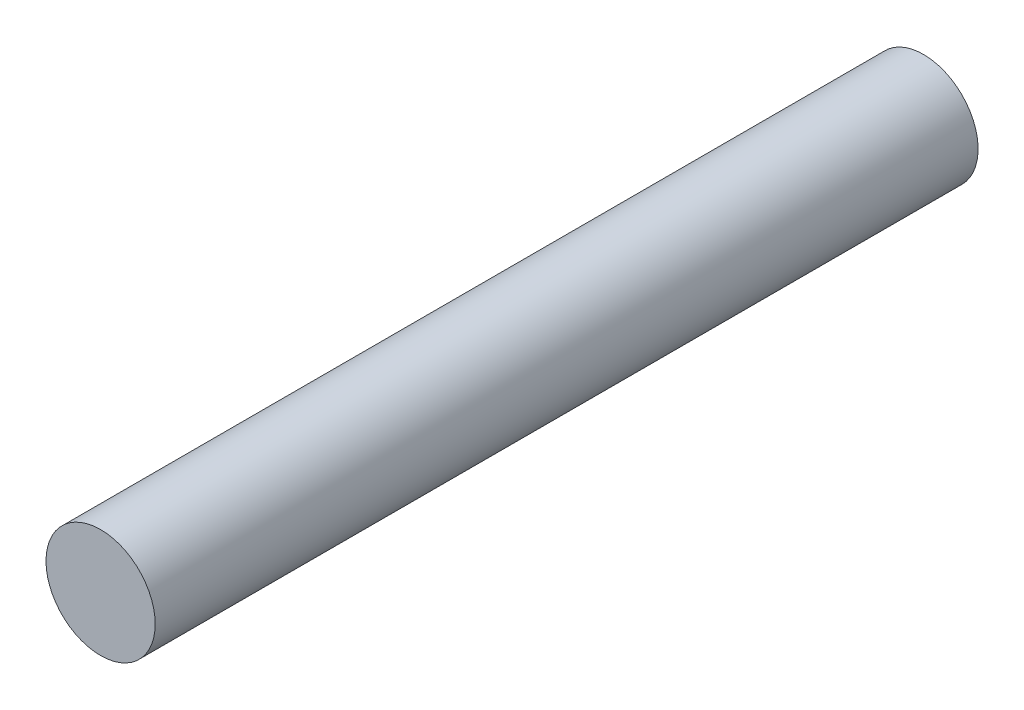
ISO-10303-21;
HEADER;
FILE_DESCRIPTION(('STEP AP214'),'2;1');
FILE_NAME('part.step','',(''),(''),'','','');
FILE_SCHEMA(('AUTOMOTIVE_DESIGN { 1 0 10303 214 1 1 1 1 }'));
ENDSEC;
DATA;
#1=APPLICATION_CONTEXT('core data for automotive mechanical design processes');
#2=APPLICATION_PROTOCOL_DEFINITION('international standard','automotive_design',2000,#1);
#3=PRODUCT_CONTEXT('',#1,'mechanical');
#4=PRODUCT('Part','Part','',(#3));
#5=PRODUCT_RELATED_PRODUCT_CATEGORY('part','',(#4));
#6=PRODUCT_DEFINITION_FORMATION('','',#4);
#7=PRODUCT_DEFINITION_CONTEXT('part definition',#1,'design');
#8=PRODUCT_DEFINITION('design','',#6,#7);
#9=PRODUCT_DEFINITION_SHAPE('','',#8);
#10=(LENGTH_UNIT() NAMED_UNIT(*) SI_UNIT(.MILLI.,.METRE.));
#11=(NAMED_UNIT(*) PLANE_ANGLE_UNIT() SI_UNIT($,.RADIAN.));
#12=(NAMED_UNIT(*) SI_UNIT($,.STERADIAN.) SOLID_ANGLE_UNIT());
#13=UNCERTAINTY_MEASURE_WITH_UNIT(LENGTH_MEASURE(1.E-05),#10,'distance_accuracy_value','');
#14=(GEOMETRIC_REPRESENTATION_CONTEXT(3) GLOBAL_UNCERTAINTY_ASSIGNED_CONTEXT((#13)) GLOBAL_UNIT_ASSIGNED_CONTEXT((#10,
#11,#12)) REPRESENTATION_CONTEXT('',''));
#15=CARTESIAN_POINT('',(0.,0.,0.));
#16=DIRECTION('',(0.,0.,1.));
#17=DIRECTION('',(1.,0.,0.));
#18=AXIS2_PLACEMENT_3D('',#15,#16,#17);
#19=CARTESIAN_POINT('',(3.51567080109097,3.55528603889425,-10.));
#20=DIRECTION('',(0.999990327947954,-0.00439818264098624,0.));
#21=DIRECTION('',(0.00439818264098624,0.999990327947954,0.));
#22=AXIS2_PLACEMENT_3D('',#19,#20,#21);
#23=PLANE('',#22);
#24=DIRECTION('',(0.00439818264098624,0.999990327947954,0.));
#25=VECTOR('',#24,1.);
#26=CARTESIAN_POINT('',(3.51567080109097,3.55528603889425,-25.));
#27=LINE('',#26,#25);
#28=CARTESIAN_POINT('',(3.48426149454471,-3.58607331738116,-25.));
#29=VERTEX_POINT('',#28);
#30=CARTESIAN_POINT('',(3.51567080109097,3.55528603889425,-25.));
#31=VERTEX_POINT('',#30);
#32=EDGE_CURVE('E11',#29,#31,#27,.T.);
#33=ORIENTED_EDGE('',*,*,#32,.F.);
#34=DIRECTION('',(0.,0.,-1.));
#35=VECTOR('',#34,1.);
#36=CARTESIAN_POINT('',(3.48426149454471,-3.58607331738116,-10.));
#37=LINE('',#36,#35);
#38=CARTESIAN_POINT('',(3.48426149454471,-3.58607331738116,-10.));
#39=VERTEX_POINT('',#38);
#40=EDGE_CURVE('E64',#39,#29,#37,.T.);
#41=ORIENTED_EDGE('',*,*,#40,.F.);
#42=DIRECTION('',(-0.00439818264098624,-0.999990327947954,0.));
#43=VECTOR('',#42,1.);
#44=CARTESIAN_POINT('',(3.51567080109097,3.55528603889425,-10.));
#45=LINE('',#44,#43);
#46=CARTESIAN_POINT('',(3.51567080109097,3.55528603889425,-10.));
#47=VERTEX_POINT('',#46);
#48=EDGE_CURVE('E80',#47,#39,#45,.T.);
#49=ORIENTED_EDGE('',*,*,#48,.F.);
#50=DIRECTION('',(0.,0.,-1.));
#51=VECTOR('',#50,1.);
#52=CARTESIAN_POINT('',(3.51567080109097,3.55528603889425,-10.));
#53=LINE('',#52,#51);
#54=EDGE_CURVE('E74',#47,#31,#53,.T.);
#55=ORIENTED_EDGE('',*,*,#54,.T.);
#56=EDGE_LOOP('',(#33,#41,#49,#55));
#57=FACE_BOUND('',#56,.T.);
#58=ADVANCED_FACE('F43',(#57),#23,.F.);
#59=CARTESIAN_POINT('',(0.,0.,266.5));
#60=DIRECTION('',(0.,0.,-1.));
#61=DIRECTION('',(-1.,0.,0.));
#62=AXIS2_PLACEMENT_3D('',#59,#60,#61);
#63=CYLINDRICAL_SURFACE('',#62,20.);
#64=CARTESIAN_POINT('',(0.,0.,266.5));
#65=DIRECTION('',(0.,0.,1.));
#66=DIRECTION('',(1.,0.,0.));
#67=AXIS2_PLACEMENT_3D('',#64,#65,#66);
#68=CIRCLE('',#67,20.);
#69=CARTESIAN_POINT('',(20.,0.,266.5));
#70=VERTEX_POINT('',#69);
#71=EDGE_CURVE('E52',#70,#70,#68,.T.);
#72=ORIENTED_EDGE('',*,*,#71,.F.);
#73=EDGE_LOOP('',(#72));
#74=FACE_BOUND('',#73,.T.);
#75=CARTESIAN_POINT('',(0.,0.,-35.));
#76=DIRECTION('',(0.,0.,-1.));
#77=DIRECTION('',(-1.,0.,0.));
#78=AXIS2_PLACEMENT_3D('',#75,#76,#77);
#79=CIRCLE('',#78,20.);
#80=CARTESIAN_POINT('',(-20.,0.,-35.));
#81=VERTEX_POINT('',#80);
#82=EDGE_CURVE('E85',#81,#81,#79,.T.);
#83=ORIENTED_EDGE('',*,*,#82,.F.);
#84=EDGE_LOOP('',(#83));
#85=FACE_BOUND('',#84,.T.);
#86=ADVANCED_FACE('F45',(#74,#85),#63,.T.);
#87=CARTESIAN_POINT('',(0.,0.,266.5));
#88=DIRECTION('',(0.,0.,1.));
#89=DIRECTION('',(1.,0.,0.));
#90=AXIS2_PLACEMENT_3D('',#87,#88,#89);
#91=PLANE('',#90);
#92=ORIENTED_EDGE('',*,*,#71,.T.);
#93=EDGE_LOOP('',(#92));
#94=FACE_BOUND('',#93,.T.);
#95=ADVANCED_FACE('F97',(#94),#91,.T.);
#96=CARTESIAN_POINT('',(0.,0.,-35.));
#97=DIRECTION('',(0.,0.,-1.));
#98=DIRECTION('',(-1.,0.,0.));
#99=AXIS2_PLACEMENT_3D('',#96,#97,#98);
#100=PLANE('',#99);
#101=CARTESIAN_POINT('',(0.,0.,-35.));
#102=DIRECTION('',(0.,0.,-1.));
#103=DIRECTION('',(-1.,0.,0.));
#104=AXIS2_PLACEMENT_3D('',#101,#102,#103);
#105=CIRCLE('',#104,5.);
#106=CARTESIAN_POINT('',(-5.,0.,-35.));
#107=VERTEX_POINT('',#106);
#108=EDGE_CURVE('E77',#107,#107,#105,.T.);
#109=ORIENTED_EDGE('',*,*,#108,.F.);
#110=EDGE_LOOP('',(#109));
#111=FACE_BOUND('',#110,.T.);
#112=ORIENTED_EDGE('',*,*,#82,.T.);
#113=EDGE_LOOP('',(#112));
#114=FACE_BOUND('',#113,.T.);
#115=ADVANCED_FACE('F103',(#111,#114),#100,.T.);
#116=CARTESIAN_POINT('',(0.,0.,-10.));
#117=DIRECTION('',(0.,0.,-1.));
#118=DIRECTION('',(-1.,0.,0.));
#119=AXIS2_PLACEMENT_3D('',#116,#117,#118);
#120=CYLINDRICAL_SURFACE('',#119,5.);
#121=ORIENTED_EDGE('',*,*,#108,.T.);
#122=EDGE_LOOP('',(#121));
#123=FACE_BOUND('',#122,.T.);
#124=CARTESIAN_POINT('',(0.,0.,-25.));
#125=DIRECTION('',(0.,0.,-1.));
#126=DIRECTION('',(-1.,0.,0.));
#127=AXIS2_PLACEMENT_3D('',#124,#125,#126);
#128=CIRCLE('',#127,5.);
#129=EDGE_CURVE('E57',#31,#29,#128,.T.);
#130=ORIENTED_EDGE('',*,*,#129,.F.);
#131=ORIENTED_EDGE('',*,*,#54,.F.);
#132=CARTESIAN_POINT('',(0.,0.,-10.));
#133=DIRECTION('',(0.,0.,-1.));
#134=DIRECTION('',(-1.,0.,0.));
#135=AXIS2_PLACEMENT_3D('',#132,#133,#134);
#136=CIRCLE('',#135,5.);
#137=EDGE_CURVE('E87',#39,#47,#136,.T.);
#138=ORIENTED_EDGE('',*,*,#137,.F.);
#139=ORIENTED_EDGE('',*,*,#40,.T.);
#140=EDGE_LOOP('',(#130,#131,#138,#139));
#141=FACE_BOUND('',#140,.T.);
#142=ADVANCED_FACE('F73',(#123,#141),#120,.F.);
#143=CARTESIAN_POINT('',(0.,0.,-10.));
#144=DIRECTION('',(0.,0.,-1.));
#145=DIRECTION('',(-1.,0.,0.));
#146=AXIS2_PLACEMENT_3D('',#143,#144,#145);
#147=PLANE('',#146);
#148=ORIENTED_EDGE('',*,*,#137,.T.);
#149=ORIENTED_EDGE('',*,*,#48,.T.);
#150=EDGE_LOOP('',(#148,#149));
#151=FACE_BOUND('',#150,.T.);
#152=ADVANCED_FACE('F111',(#151),#147,.T.);
#153=CARTESIAN_POINT('',(0.,0.,-25.));
#154=DIRECTION('',(0.,0.,-1.));
#155=DIRECTION('',(-1.,0.,0.));
#156=AXIS2_PLACEMENT_3D('',#153,#154,#155);
#157=PLANE('',#156);
#158=ORIENTED_EDGE('',*,*,#32,.T.);
#159=ORIENTED_EDGE('',*,*,#129,.T.);
#160=EDGE_LOOP('',(#158,#159));
#161=FACE_BOUND('',#160,.T.);
#162=ADVANCED_FACE('F70',(#161),#157,.T.);
#163=CLOSED_SHELL('',(#58,#86,#95,#115,#142,#152,#162));
#164=MANIFOLD_SOLID_BREP('B2',#163);
#165=ADVANCED_BREP_SHAPE_REPRESENTATION('',(#18,#164),#14);
#166=SHAPE_DEFINITION_REPRESENTATION(#9,#165);
ENDSEC;
END-ISO-10303-21;
